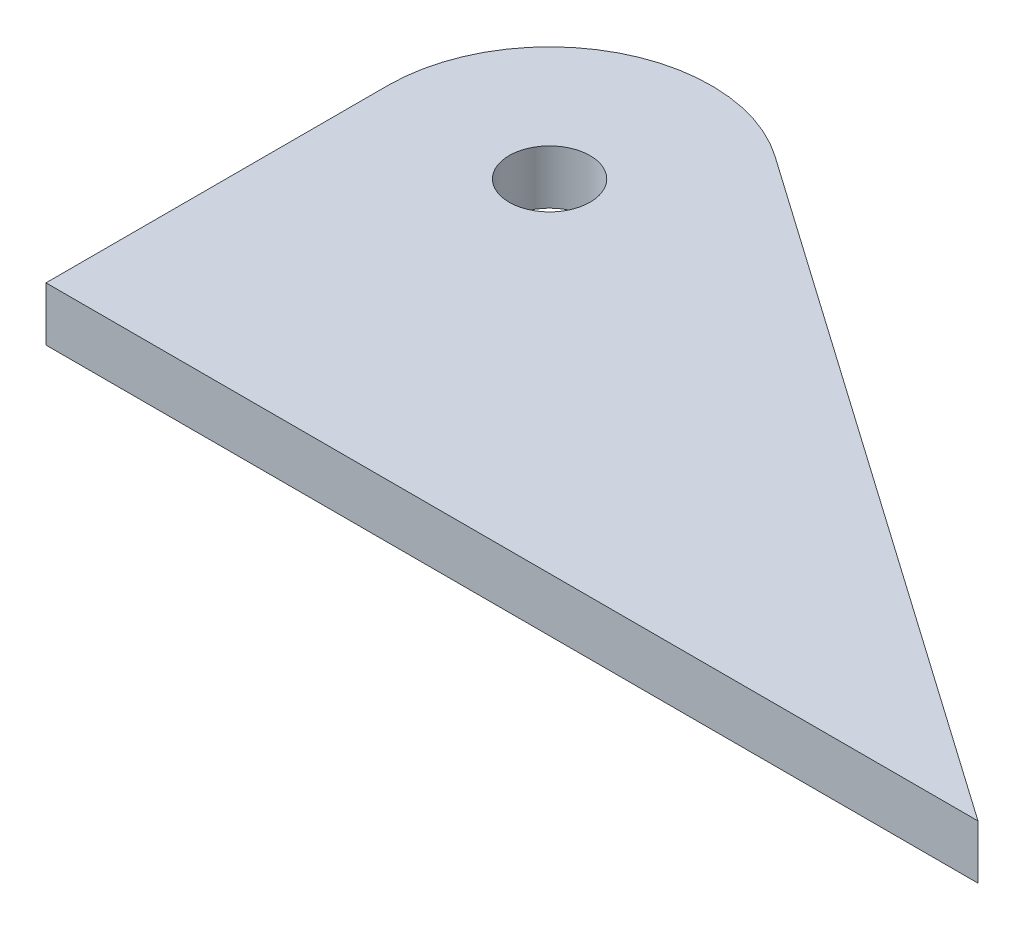
ISO-10303-21;
HEADER;
FILE_DESCRIPTION(('STEP AP214'),'2;1');
FILE_NAME('part.step','',(''),(''),'','','');
FILE_SCHEMA(('AUTOMOTIVE_DESIGN { 1 0 10303 214 1 1 1 1 }'));
ENDSEC;
DATA;
#1=APPLICATION_CONTEXT('core data for automotive mechanical design processes');
#2=APPLICATION_PROTOCOL_DEFINITION('international standard','automotive_design',2000,#1);
#3=PRODUCT_CONTEXT('',#1,'mechanical');
#4=PRODUCT('Part','Part','',(#3));
#5=PRODUCT_RELATED_PRODUCT_CATEGORY('part','',(#4));
#6=PRODUCT_DEFINITION_FORMATION('','',#4);
#7=PRODUCT_DEFINITION_CONTEXT('part definition',#1,'design');
#8=PRODUCT_DEFINITION('design','',#6,#7);
#9=PRODUCT_DEFINITION_SHAPE('','',#8);
#10=(LENGTH_UNIT() NAMED_UNIT(*) SI_UNIT(.MILLI.,.METRE.));
#11=(NAMED_UNIT(*) PLANE_ANGLE_UNIT() SI_UNIT($,.RADIAN.));
#12=(NAMED_UNIT(*) SI_UNIT($,.STERADIAN.) SOLID_ANGLE_UNIT());
#13=UNCERTAINTY_MEASURE_WITH_UNIT(LENGTH_MEASURE(1.E-05),#10,'distance_accuracy_value','');
#14=(GEOMETRIC_REPRESENTATION_CONTEXT(3) GLOBAL_UNCERTAINTY_ASSIGNED_CONTEXT((#13)) GLOBAL_UNIT_ASSIGNED_CONTEXT((#10,
#11,#12)) REPRESENTATION_CONTEXT('',''));
#15=CARTESIAN_POINT('',(0.,0.,0.));
#16=DIRECTION('',(0.,0.,1.));
#17=DIRECTION('',(1.,0.,0.));
#18=AXIS2_PLACEMENT_3D('',#15,#16,#17);
#19=CARTESIAN_POINT('',(0.,6.35,0.));
#20=DIRECTION('',(0.,0.,-1.));
#21=DIRECTION('',(-1.,0.,0.));
#22=AXIS2_PLACEMENT_3D('',#19,#20,#21);
#23=PLANE('',#22);
#24=DIRECTION('',(1.,0.,0.));
#25=VECTOR('',#24,1.);
#26=CARTESIAN_POINT('',(0.,0.,0.));
#27=LINE('',#26,#25);
#28=CARTESIAN_POINT('',(0.,0.,0.));
#29=VERTEX_POINT('',#28);
#30=CARTESIAN_POINT('',(109.737398428125,0.,0.));
#31=VERTEX_POINT('',#30);
#32=EDGE_CURVE('E102',#29,#31,#27,.T.);
#33=ORIENTED_EDGE('',*,*,#32,.T.);
#34=DIRECTION('',(0.,-1.,0.));
#35=VECTOR('',#34,1.);
#36=CARTESIAN_POINT('',(109.737398428125,6.35,0.));
#37=LINE('',#36,#35);
#38=CARTESIAN_POINT('',(109.737398428125,6.35,0.));
#39=VERTEX_POINT('',#38);
#40=EDGE_CURVE('E11',#39,#31,#37,.T.);
#41=ORIENTED_EDGE('',*,*,#40,.F.);
#42=DIRECTION('',(1.,0.,0.));
#43=VECTOR('',#42,1.);
#44=CARTESIAN_POINT('',(0.,6.35,0.));
#45=LINE('',#44,#43);
#46=CARTESIAN_POINT('',(0.,6.35,0.));
#47=VERTEX_POINT('',#46);
#48=EDGE_CURVE('E85',#47,#39,#45,.T.);
#49=ORIENTED_EDGE('',*,*,#48,.F.);
#50=DIRECTION('',(0.,-1.,0.));
#51=VECTOR('',#50,1.);
#52=CARTESIAN_POINT('',(0.,6.35,0.));
#53=LINE('',#52,#51);
#54=EDGE_CURVE('E52',#47,#29,#53,.T.);
#55=ORIENTED_EDGE('',*,*,#54,.T.);
#56=EDGE_LOOP('',(#33,#41,#49,#55));
#57=FACE_BOUND('',#56,.T.);
#58=ADVANCED_FACE('F35',(#57),#23,.F.);
#59=CARTESIAN_POINT('',(36.1024988447754,6.35,-51.5597117635761));
#60=DIRECTION('',(-0.573576436351041,0.,0.819152044288995));
#61=DIRECTION('',(0.819152044288995,0.,0.573576436351041));
#62=AXIS2_PLACEMENT_3D('',#59,#60,#61);
#63=PLANE('',#62);
#64=DIRECTION('',(-0.819152044288995,0.,-0.573576436351041));
#65=VECTOR('',#64,1.);
#66=CARTESIAN_POINT('',(36.1024988447754,0.,-51.5597117635761));
#67=LINE('',#66,#65);
#68=CARTESIAN_POINT('',(29.9766311124874,0.,-55.8490905277997));
#69=VERTEX_POINT('',#68);
#70=EDGE_CURVE('E90',#31,#69,#67,.T.);
#71=ORIENTED_EDGE('',*,*,#70,.T.);
#72=DIRECTION('',(0.,-1.,0.));
#73=VECTOR('',#72,1.);
#74=CARTESIAN_POINT('',(29.9766311124874,6.35,-55.8490905277997));
#75=LINE('',#74,#73);
#76=CARTESIAN_POINT('',(29.9766311124874,6.35,-55.8490905277997));
#77=VERTEX_POINT('',#76);
#78=EDGE_CURVE('E44',#77,#69,#75,.T.);
#79=ORIENTED_EDGE('',*,*,#78,.F.);
#80=DIRECTION('',(-0.819152044288995,0.,-0.573576436351041));
#81=VECTOR('',#80,1.);
#82=CARTESIAN_POINT('',(36.1024988447754,6.35,-51.5597117635761));
#83=LINE('',#82,#81);
#84=EDGE_CURVE('E78',#39,#77,#83,.T.);
#85=ORIENTED_EDGE('',*,*,#84,.F.);
#86=ORIENTED_EDGE('',*,*,#40,.T.);
#87=EDGE_LOOP('',(#71,#79,#85,#86));
#88=FACE_BOUND('',#87,.T.);
#89=ADVANCED_FACE('F89',(#88),#63,.F.);
#90=CARTESIAN_POINT('',(19.05,6.35,-40.2442440840944));
#91=DIRECTION('',(0.,-1.,0.));
#92=DIRECTION('',(0.,0.,-1.));
#93=AXIS2_PLACEMENT_3D('',#90,#91,#92);
#94=CYLINDRICAL_SURFACE('',#93,19.05);
#95=CARTESIAN_POINT('',(19.05,0.,-40.2442440840944));
#96=DIRECTION('',(0.,1.,0.));
#97=DIRECTION('',(0.,0.,1.));
#98=AXIS2_PLACEMENT_3D('',#95,#96,#97);
#99=CIRCLE('',#98,19.05);
#100=CARTESIAN_POINT('',(0.,0.,-40.2442440840944));
#101=VERTEX_POINT('',#100);
#102=EDGE_CURVE('E105',#69,#101,#99,.T.);
#103=ORIENTED_EDGE('',*,*,#102,.T.);
#104=DIRECTION('',(0.,-1.,0.));
#105=VECTOR('',#104,1.);
#106=CARTESIAN_POINT('',(0.,6.35,-40.2442440840944));
#107=LINE('',#106,#105);
#108=CARTESIAN_POINT('',(0.,6.35,-40.2442440840944));
#109=VERTEX_POINT('',#108);
#110=EDGE_CURVE('E67',#109,#101,#107,.T.);
#111=ORIENTED_EDGE('',*,*,#110,.F.);
#112=CARTESIAN_POINT('',(19.05,6.35,-40.2442440840944));
#113=DIRECTION('',(0.,1.,0.));
#114=DIRECTION('',(0.,0.,1.));
#115=AXIS2_PLACEMENT_3D('',#112,#113,#114);
#116=CIRCLE('',#115,19.05);
#117=EDGE_CURVE('E84',#77,#109,#116,.T.);
#118=ORIENTED_EDGE('',*,*,#117,.F.);
#119=ORIENTED_EDGE('',*,*,#78,.T.);
#120=EDGE_LOOP('',(#103,#111,#118,#119));
#121=FACE_BOUND('',#120,.T.);
#122=ADVANCED_FACE('F93',(#121),#94,.T.);
#123=CARTESIAN_POINT('',(19.05,6.35,-40.2442440840944));
#124=DIRECTION('',(0.,-1.,0.));
#125=DIRECTION('',(0.,0.,-1.));
#126=AXIS2_PLACEMENT_3D('',#123,#124,#125);
#127=CYLINDRICAL_SURFACE('',#126,4.7625);
#128=CARTESIAN_POINT('',(19.05,6.35,-40.2442440840944));
#129=DIRECTION('',(0.,1.,0.));
#130=DIRECTION('',(0.,0.,1.));
#131=AXIS2_PLACEMENT_3D('',#128,#129,#130);
#132=CIRCLE('',#131,4.7625);
#133=CARTESIAN_POINT('',(19.05,6.35,-35.4817440840944));
#134=VERTEX_POINT('',#133);
#135=EDGE_CURVE('E110',#134,#134,#132,.T.);
#136=ORIENTED_EDGE('',*,*,#135,.T.);
#137=EDGE_LOOP('',(#136));
#138=FACE_BOUND('',#137,.T.);
#139=CARTESIAN_POINT('',(19.05,0.,-40.2442440840944));
#140=DIRECTION('',(0.,1.,0.));
#141=DIRECTION('',(0.,0.,1.));
#142=AXIS2_PLACEMENT_3D('',#139,#140,#141);
#143=CIRCLE('',#142,4.7625);
#144=CARTESIAN_POINT('',(19.05,0.,-35.4817440840944));
#145=VERTEX_POINT('',#144);
#146=EDGE_CURVE('E99',#145,#145,#143,.T.);
#147=ORIENTED_EDGE('',*,*,#146,.F.);
#148=EDGE_LOOP('',(#147));
#149=FACE_BOUND('',#148,.T.);
#150=ADVANCED_FACE('F37',(#138,#149),#127,.F.);
#151=CARTESIAN_POINT('',(0.,6.35,0.));
#152=DIRECTION('',(-1.,0.,0.));
#153=DIRECTION('',(0.,0.,1.));
#154=AXIS2_PLACEMENT_3D('',#151,#152,#153);
#155=PLANE('',#154);
#156=DIRECTION('',(0.,0.,-1.));
#157=VECTOR('',#156,1.);
#158=CARTESIAN_POINT('',(0.,0.,0.));
#159=LINE('',#158,#157);
#160=EDGE_CURVE('E107',#29,#101,#159,.T.);
#161=ORIENTED_EDGE('',*,*,#160,.F.);
#162=ORIENTED_EDGE('',*,*,#54,.F.);
#163=DIRECTION('',(0.,0.,-1.));
#164=VECTOR('',#163,1.);
#165=CARTESIAN_POINT('',(0.,6.35,0.));
#166=LINE('',#165,#164);
#167=EDGE_CURVE('E94',#47,#109,#166,.T.);
#168=ORIENTED_EDGE('',*,*,#167,.T.);
#169=ORIENTED_EDGE('',*,*,#110,.T.);
#170=EDGE_LOOP('',(#161,#162,#168,#169));
#171=FACE_BOUND('',#170,.T.);
#172=ADVANCED_FACE('F121',(#171),#155,.T.);
#173=CARTESIAN_POINT('',(0.,6.35,0.));
#174=DIRECTION('',(0.,1.,0.));
#175=DIRECTION('',(0.,0.,1.));
#176=AXIS2_PLACEMENT_3D('',#173,#174,#175);
#177=PLANE('',#176);
#178=ORIENTED_EDGE('',*,*,#135,.F.);
#179=EDGE_LOOP('',(#178));
#180=FACE_BOUND('',#179,.T.);
#181=ORIENTED_EDGE('',*,*,#48,.T.);
#182=ORIENTED_EDGE('',*,*,#84,.T.);
#183=ORIENTED_EDGE('',*,*,#117,.T.);
#184=ORIENTED_EDGE('',*,*,#167,.F.);
#185=EDGE_LOOP('',(#181,#182,#183,#184));
#186=FACE_BOUND('',#185,.T.);
#187=ADVANCED_FACE('F81',(#180,#186),#177,.T.);
#188=CARTESIAN_POINT('',(0.,0.,0.));
#189=DIRECTION('',(0.,1.,0.));
#190=DIRECTION('',(0.,0.,1.));
#191=AXIS2_PLACEMENT_3D('',#188,#189,#190);
#192=PLANE('',#191);
#193=ORIENTED_EDGE('',*,*,#146,.T.);
#194=EDGE_LOOP('',(#193));
#195=FACE_BOUND('',#194,.T.);
#196=ORIENTED_EDGE('',*,*,#32,.F.);
#197=ORIENTED_EDGE('',*,*,#160,.T.);
#198=ORIENTED_EDGE('',*,*,#102,.F.);
#199=ORIENTED_EDGE('',*,*,#70,.F.);
#200=EDGE_LOOP('',(#196,#197,#198,#199));
#201=FACE_BOUND('',#200,.T.);
#202=ADVANCED_FACE('F120',(#195,#201),#192,.F.);
#203=CLOSED_SHELL('',(#58,#89,#122,#150,#172,#187,#202));
#204=MANIFOLD_SOLID_BREP('B2',#203);
#205=ADVANCED_BREP_SHAPE_REPRESENTATION('',(#18,#204),#14);
#206=SHAPE_DEFINITION_REPRESENTATION(#9,#205);
ENDSEC;
END-ISO-10303-21;
